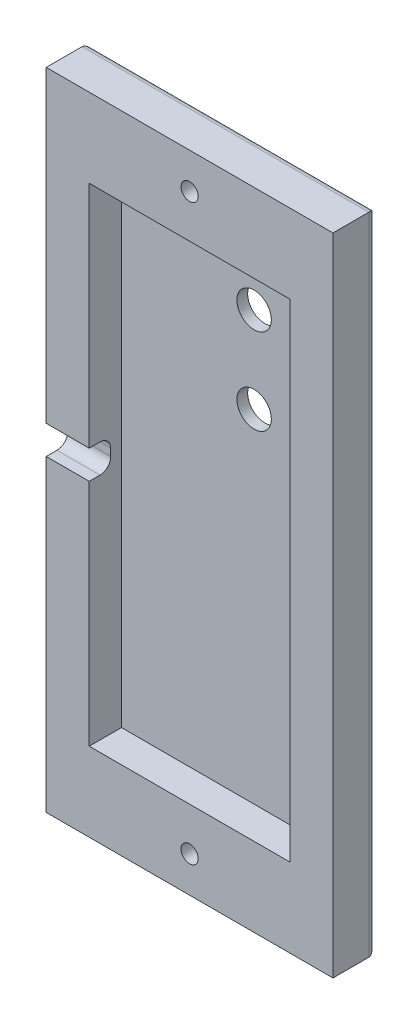
ISO-10303-21;
HEADER;
FILE_DESCRIPTION(('STEP AP214'),'2;1');
FILE_NAME('part.step','',(''),(''),'','','');
FILE_SCHEMA(('AUTOMOTIVE_DESIGN { 1 0 10303 214 1 1 1 1 }'));
ENDSEC;
DATA;
#1=APPLICATION_CONTEXT('core data for automotive mechanical design processes');
#2=APPLICATION_PROTOCOL_DEFINITION('international standard','automotive_design',2000,#1);
#3=PRODUCT_CONTEXT('',#1,'mechanical');
#4=PRODUCT('Part','Part','',(#3));
#5=PRODUCT_RELATED_PRODUCT_CATEGORY('part','',(#4));
#6=PRODUCT_DEFINITION_FORMATION('','',#4);
#7=PRODUCT_DEFINITION_CONTEXT('part definition',#1,'design');
#8=PRODUCT_DEFINITION('design','',#6,#7);
#9=PRODUCT_DEFINITION_SHAPE('','',#8);
#10=(LENGTH_UNIT() NAMED_UNIT(*) SI_UNIT(.MILLI.,.METRE.));
#11=(NAMED_UNIT(*) PLANE_ANGLE_UNIT() SI_UNIT($,.RADIAN.));
#12=(NAMED_UNIT(*) SI_UNIT($,.STERADIAN.) SOLID_ANGLE_UNIT());
#13=UNCERTAINTY_MEASURE_WITH_UNIT(LENGTH_MEASURE(1.E-05),#10,'distance_accuracy_value','');
#14=(GEOMETRIC_REPRESENTATION_CONTEXT(3) GLOBAL_UNCERTAINTY_ASSIGNED_CONTEXT((#13)) GLOBAL_UNIT_ASSIGNED_CONTEXT((#10,
#11,#12)) REPRESENTATION_CONTEXT('',''));
#15=CARTESIAN_POINT('',(0.,0.,0.));
#16=DIRECTION('',(0.,0.,1.));
#17=DIRECTION('',(1.,0.,0.));
#18=AXIS2_PLACEMENT_3D('',#15,#16,#17);
#19=CARTESIAN_POINT('',(-40.,0.,6.));
#20=DIRECTION('',(1.,0.,0.));
#21=DIRECTION('',(0.,0.,-1.));
#22=AXIS2_PLACEMENT_3D('',#19,#20,#21);
#23=PLANE('',#22);
#24=DIRECTION('',(0.,0.,-1.));
#25=VECTOR('',#24,1.);
#26=CARTESIAN_POINT('',(-40.,47.,6.));
#27=LINE('',#26,#25);
#28=CARTESIAN_POINT('',(-40.,47.,6.));
#29=VERTEX_POINT('',#28);
#30=CARTESIAN_POINT('',(-40.,47.,4.5));
#31=VERTEX_POINT('',#30);
#32=EDGE_CURVE('E258',#29,#31,#27,.T.);
#33=ORIENTED_EDGE('',*,*,#32,.F.);
#34=DIRECTION('',(0.,-1.,0.));
#35=VECTOR('',#34,1.);
#36=CARTESIAN_POINT('',(-40.,0.,6.));
#37=LINE('',#36,#35);
#38=CARTESIAN_POINT('',(-40.,90.,6.));
#39=VERTEX_POINT('',#38);
#40=EDGE_CURVE('E174',#39,#29,#37,.T.);
#41=ORIENTED_EDGE('',*,*,#40,.F.);
#42=DIRECTION('',(0.,0.,-1.));
#43=VECTOR('',#42,1.);
#44=CARTESIAN_POINT('',(-40.,90.,6.));
#45=LINE('',#44,#43);
#46=CARTESIAN_POINT('',(-40.,90.,1.));
#47=VERTEX_POINT('',#46);
#48=EDGE_CURVE('E183',#39,#47,#45,.T.);
#49=ORIENTED_EDGE('',*,*,#48,.T.);
#50=DIRECTION('',(0.,-1.,0.));
#51=VECTOR('',#50,1.);
#52=CARTESIAN_POINT('',(-40.,0.,1.));
#53=LINE('',#52,#51);
#54=CARTESIAN_POINT('',(-40.,0.,1.));
#55=VERTEX_POINT('',#54);
#56=EDGE_CURVE('E212',#47,#55,#53,.T.);
#57=ORIENTED_EDGE('',*,*,#56,.T.);
#58=DIRECTION('',(0.,0.,-1.));
#59=VECTOR('',#58,1.);
#60=CARTESIAN_POINT('',(-40.,0.,6.));
#61=LINE('',#60,#59);
#62=CARTESIAN_POINT('',(-40.,0.,6.));
#63=VERTEX_POINT('',#62);
#64=EDGE_CURVE('E173',#63,#55,#61,.T.);
#65=ORIENTED_EDGE('',*,*,#64,.F.);
#66=CARTESIAN_POINT('',(-40.,43.,6.));
#67=VERTEX_POINT('',#66);
#68=EDGE_CURVE('E168',#67,#63,#37,.T.);
#69=ORIENTED_EDGE('',*,*,#68,.F.);
#70=DIRECTION('',(0.,0.,1.));
#71=VECTOR('',#70,1.);
#72=CARTESIAN_POINT('',(-40.,43.,6.));
#73=LINE('',#72,#71);
#74=CARTESIAN_POINT('',(-40.,43.,4.5));
#75=VERTEX_POINT('',#74);
#76=EDGE_CURVE('E155',#75,#67,#73,.T.);
#77=ORIENTED_EDGE('',*,*,#76,.F.);
#78=CARTESIAN_POINT('',(-40.,44.5,4.5));
#79=DIRECTION('',(1.,0.,0.));
#80=DIRECTION('',(0.,0.,-1.));
#81=AXIS2_PLACEMENT_3D('',#78,#79,#80);
#82=CIRCLE('',#81,1.5);
#83=CARTESIAN_POINT('',(-40.,44.5,3.));
#84=VERTEX_POINT('',#83);
#85=EDGE_CURVE('E242',#75,#84,#82,.T.);
#86=ORIENTED_EDGE('',*,*,#85,.T.);
#87=DIRECTION('',(0.,-1.,0.));
#88=VECTOR('',#87,1.);
#89=CARTESIAN_POINT('',(-40.,47.,3.));
#90=LINE('',#89,#88);
#91=CARTESIAN_POINT('',(-40.,45.5,3.));
#92=VERTEX_POINT('',#91);
#93=EDGE_CURVE('E163',#92,#84,#90,.T.);
#94=ORIENTED_EDGE('',*,*,#93,.F.);
#95=CARTESIAN_POINT('',(-40.,45.5,4.5));
#96=DIRECTION('',(1.,0.,0.));
#97=DIRECTION('',(0.,0.,-1.));
#98=AXIS2_PLACEMENT_3D('',#95,#96,#97);
#99=CIRCLE('',#98,1.5);
#100=EDGE_CURVE('E50',#92,#31,#99,.T.);
#101=ORIENTED_EDGE('',*,*,#100,.T.);
#102=EDGE_LOOP('',(#33,#41,#49,#57,#65,#69,#77,#86,#94,#101));
#103=FACE_BOUND('',#102,.T.);
#104=ADVANCED_FACE('F39',(#103),#23,.F.);
#105=CARTESIAN_POINT('',(-20.,85.,0.));
#106=DIRECTION('',(0.,0.,1.));
#107=DIRECTION('',(1.,0.,0.));
#108=AXIS2_PLACEMENT_3D('',#105,#106,#107);
#109=CYLINDRICAL_SURFACE('',#108,1.2);
#110=CARTESIAN_POINT('',(-20.,85.,6.));
#111=DIRECTION('',(0.,0.,1.));
#112=DIRECTION('',(1.,0.,0.));
#113=AXIS2_PLACEMENT_3D('',#110,#111,#112);
#114=CIRCLE('',#113,1.2);
#115=CARTESIAN_POINT('',(-18.8,85.,6.));
#116=VERTEX_POINT('',#115);
#117=EDGE_CURVE('E286',#116,#116,#114,.T.);
#118=ORIENTED_EDGE('',*,*,#117,.T.);
#119=EDGE_LOOP('',(#118));
#120=FACE_BOUND('',#119,.T.);
#121=CARTESIAN_POINT('',(-20.,85.,2.4));
#122=DIRECTION('',(0.,0.,-1.));
#123=DIRECTION('',(-1.,0.,0.));
#124=AXIS2_PLACEMENT_3D('',#121,#122,#123);
#125=CIRCLE('',#124,1.2);
#126=CARTESIAN_POINT('',(-21.2,85.,2.4));
#127=VERTEX_POINT('',#126);
#128=EDGE_CURVE('E200',#127,#127,#125,.F.);
#129=ORIENTED_EDGE('',*,*,#128,.F.);
#130=EDGE_LOOP('',(#129));
#131=FACE_BOUND('',#130,.T.);
#132=ADVANCED_FACE('F371',(#120,#131),#109,.F.);
#133=CARTESIAN_POINT('',(-20.,5.,0.));
#134=DIRECTION('',(0.,0.,1.));
#135=DIRECTION('',(1.,0.,0.));
#136=AXIS2_PLACEMENT_3D('',#133,#134,#135);
#137=CYLINDRICAL_SURFACE('',#136,1.2);
#138=CARTESIAN_POINT('',(-20.,5.,6.));
#139=DIRECTION('',(0.,0.,1.));
#140=DIRECTION('',(1.,0.,0.));
#141=AXIS2_PLACEMENT_3D('',#138,#139,#140);
#142=CIRCLE('',#141,1.2);
#143=CARTESIAN_POINT('',(-18.8,5.,6.));
#144=VERTEX_POINT('',#143);
#145=EDGE_CURVE('E276',#144,#144,#142,.T.);
#146=ORIENTED_EDGE('',*,*,#145,.T.);
#147=EDGE_LOOP('',(#146));
#148=FACE_BOUND('',#147,.T.);
#149=CARTESIAN_POINT('',(-20.,5.,2.4));
#150=DIRECTION('',(0.,0.,-1.));
#151=DIRECTION('',(-1.,0.,0.));
#152=AXIS2_PLACEMENT_3D('',#149,#150,#151);
#153=CIRCLE('',#152,1.2);
#154=CARTESIAN_POINT('',(-21.2,5.,2.4));
#155=VERTEX_POINT('',#154);
#156=EDGE_CURVE('E193',#155,#155,#153,.F.);
#157=ORIENTED_EDGE('',*,*,#156,.F.);
#158=EDGE_LOOP('',(#157));
#159=FACE_BOUND('',#158,.T.);
#160=ADVANCED_FACE('F380',(#148,#159),#137,.F.);
#161=CARTESIAN_POINT('',(0.,0.,6.));
#162=DIRECTION('',(0.,1.,0.));
#163=DIRECTION('',(0.,0.,1.));
#164=AXIS2_PLACEMENT_3D('',#161,#162,#163);
#165=PLANE('',#164);
#166=ORIENTED_EDGE('',*,*,#64,.T.);
#167=DIRECTION('',(1.,0.,0.));
#168=VECTOR('',#167,1.);
#169=CARTESIAN_POINT('',(0.,0.,1.));
#170=LINE('',#169,#168);
#171=CARTESIAN_POINT('',(0.,0.,1.));
#172=VERTEX_POINT('',#171);
#173=EDGE_CURVE('E220',#55,#172,#170,.T.);
#174=ORIENTED_EDGE('',*,*,#173,.T.);
#175=DIRECTION('',(0.,0.,-1.));
#176=VECTOR('',#175,1.);
#177=CARTESIAN_POINT('',(0.,0.,6.));
#178=LINE('',#177,#176);
#179=CARTESIAN_POINT('',(0.,0.,6.));
#180=VERTEX_POINT('',#179);
#181=EDGE_CURVE('E188',#180,#172,#178,.T.);
#182=ORIENTED_EDGE('',*,*,#181,.F.);
#183=DIRECTION('',(1.,0.,0.));
#184=VECTOR('',#183,1.);
#185=CARTESIAN_POINT('',(0.,0.,6.));
#186=LINE('',#185,#184);
#187=EDGE_CURVE('E317',#63,#180,#186,.T.);
#188=ORIENTED_EDGE('',*,*,#187,.F.);
#189=EDGE_LOOP('',(#166,#174,#182,#188));
#190=FACE_BOUND('',#189,.T.);
#191=ADVANCED_FACE('F386',(#190),#165,.F.);
#192=CARTESIAN_POINT('',(0.,0.,6.));
#193=DIRECTION('',(-1.,0.,0.));
#194=DIRECTION('',(0.,0.,1.));
#195=AXIS2_PLACEMENT_3D('',#192,#193,#194);
#196=PLANE('',#195);
#197=ORIENTED_EDGE('',*,*,#181,.T.);
#198=DIRECTION('',(0.,1.,0.));
#199=VECTOR('',#198,1.);
#200=CARTESIAN_POINT('',(0.,90.,1.));
#201=LINE('',#200,#199);
#202=CARTESIAN_POINT('',(0.,90.,1.));
#203=VERTEX_POINT('',#202);
#204=EDGE_CURVE('E215',#172,#203,#201,.T.);
#205=ORIENTED_EDGE('',*,*,#204,.T.);
#206=DIRECTION('',(0.,0.,-1.));
#207=VECTOR('',#206,1.);
#208=CARTESIAN_POINT('',(0.,90.,6.));
#209=LINE('',#208,#207);
#210=CARTESIAN_POINT('',(0.,90.,6.));
#211=VERTEX_POINT('',#210);
#212=EDGE_CURVE('E190',#211,#203,#209,.T.);
#213=ORIENTED_EDGE('',*,*,#212,.F.);
#214=DIRECTION('',(0.,1.,0.));
#215=VECTOR('',#214,1.);
#216=CARTESIAN_POINT('',(0.,0.,6.));
#217=LINE('',#216,#215);
#218=EDGE_CURVE('E177',#180,#211,#217,.T.);
#219=ORIENTED_EDGE('',*,*,#218,.F.);
#220=EDGE_LOOP('',(#197,#205,#213,#219));
#221=FACE_BOUND('',#220,.T.);
#222=ADVANCED_FACE('F329',(#221),#196,.F.);
#223=CARTESIAN_POINT('',(0.,90.,6.));
#224=DIRECTION('',(0.,-1.,0.));
#225=DIRECTION('',(0.,0.,-1.));
#226=AXIS2_PLACEMENT_3D('',#223,#224,#225);
#227=PLANE('',#226);
#228=ORIENTED_EDGE('',*,*,#212,.T.);
#229=DIRECTION('',(-1.,0.,0.));
#230=VECTOR('',#229,1.);
#231=CARTESIAN_POINT('',(-40.,90.,1.));
#232=LINE('',#231,#230);
#233=EDGE_CURVE('E195',#203,#47,#232,.T.);
#234=ORIENTED_EDGE('',*,*,#233,.T.);
#235=ORIENTED_EDGE('',*,*,#48,.F.);
#236=DIRECTION('',(-1.,0.,0.));
#237=VECTOR('',#236,1.);
#238=CARTESIAN_POINT('',(0.,90.,6.));
#239=LINE('',#238,#237);
#240=EDGE_CURVE('E176',#211,#39,#239,.T.);
#241=ORIENTED_EDGE('',*,*,#240,.F.);
#242=EDGE_LOOP('',(#228,#234,#235,#241));
#243=FACE_BOUND('',#242,.T.);
#244=ADVANCED_FACE('F331',(#243),#227,.F.);
#245=CARTESIAN_POINT('',(0.,0.,6.));
#246=DIRECTION('',(0.,0.,-1.));
#247=DIRECTION('',(-1.,0.,0.));
#248=AXIS2_PLACEMENT_3D('',#245,#246,#247);
#249=PLANE('',#248);
#250=ORIENTED_EDGE('',*,*,#145,.F.);
#251=EDGE_LOOP('',(#250));
#252=FACE_BOUND('',#251,.T.);
#253=ORIENTED_EDGE('',*,*,#117,.F.);
#254=EDGE_LOOP('',(#253));
#255=FACE_BOUND('',#254,.T.);
#256=DIRECTION('',(0.,-1.,0.));
#257=VECTOR('',#256,1.);
#258=CARTESIAN_POINT('',(-34.,79.,6.));
#259=LINE('',#258,#257);
#260=CARTESIAN_POINT('',(-34.,43.,6.));
#261=VERTEX_POINT('',#260);
#262=CARTESIAN_POINT('',(-34.,11.,6.));
#263=VERTEX_POINT('',#262);
#264=EDGE_CURVE('E169',#261,#263,#259,.T.);
#265=ORIENTED_EDGE('',*,*,#264,.F.);
#266=DIRECTION('',(-1.,0.,0.));
#267=VECTOR('',#266,1.);
#268=CARTESIAN_POINT('',(-30.,43.,6.));
#269=LINE('',#268,#267);
#270=EDGE_CURVE('E158',#261,#67,#269,.T.);
#271=ORIENTED_EDGE('',*,*,#270,.T.);
#272=ORIENTED_EDGE('',*,*,#68,.T.);
#273=ORIENTED_EDGE('',*,*,#187,.T.);
#274=ORIENTED_EDGE('',*,*,#218,.T.);
#275=ORIENTED_EDGE('',*,*,#240,.T.);
#276=ORIENTED_EDGE('',*,*,#40,.T.);
#277=DIRECTION('',(-1.,0.,0.));
#278=VECTOR('',#277,1.);
#279=CARTESIAN_POINT('',(-30.,47.,6.));
#280=LINE('',#279,#278);
#281=CARTESIAN_POINT('',(-34.,47.,6.));
#282=VERTEX_POINT('',#281);
#283=EDGE_CURVE('E167',#282,#29,#280,.T.);
#284=ORIENTED_EDGE('',*,*,#283,.F.);
#285=CARTESIAN_POINT('',(-34.,79.,6.));
#286=VERTEX_POINT('',#285);
#287=EDGE_CURVE('E310',#286,#282,#259,.T.);
#288=ORIENTED_EDGE('',*,*,#287,.F.);
#289=DIRECTION('',(-1.,0.,0.));
#290=VECTOR('',#289,1.);
#291=CARTESIAN_POINT('',(-34.,79.,6.));
#292=LINE('',#291,#290);
#293=CARTESIAN_POINT('',(-6.00000000000001,79.,6.));
#294=VERTEX_POINT('',#293);
#295=EDGE_CURVE('E293',#294,#286,#292,.T.);
#296=ORIENTED_EDGE('',*,*,#295,.F.);
#297=DIRECTION('',(0.,1.,0.));
#298=VECTOR('',#297,1.);
#299=CARTESIAN_POINT('',(-6.00000000000001,79.,6.));
#300=LINE('',#299,#298);
#301=CARTESIAN_POINT('',(-6.00000000000001,11.,6.));
#302=VERTEX_POINT('',#301);
#303=EDGE_CURVE('E298',#302,#294,#300,.T.);
#304=ORIENTED_EDGE('',*,*,#303,.F.);
#305=DIRECTION('',(1.,0.,0.));
#306=VECTOR('',#305,1.);
#307=CARTESIAN_POINT('',(-34.,11.,6.));
#308=LINE('',#307,#306);
#309=EDGE_CURVE('E307',#263,#302,#308,.T.);
#310=ORIENTED_EDGE('',*,*,#309,.F.);
#311=EDGE_LOOP('',(#265,#271,#272,#273,#274,#275,#276,#284,#288,#296,#304,#310));
#312=FACE_BOUND('',#311,.T.);
#313=ADVANCED_FACE('F165',(#252,#255,#312),#249,.F.);
#314=CARTESIAN_POINT('',(0.,0.,0.));
#315=DIRECTION('',(0.,0.,-1.));
#316=DIRECTION('',(-1.,0.,0.));
#317=AXIS2_PLACEMENT_3D('',#314,#315,#316);
#318=PLANE('',#317);
#319=DIRECTION('',(0.,-1.,0.));
#320=VECTOR('',#319,1.);
#321=CARTESIAN_POINT('',(-39.,90.,0.));
#322=LINE('',#321,#320);
#323=CARTESIAN_POINT('',(-39.,1.,0.));
#324=VERTEX_POINT('',#323);
#325=CARTESIAN_POINT('',(-39.,89.,0.));
#326=VERTEX_POINT('',#325);
#327=EDGE_CURVE('E207',#324,#326,#322,.F.);
#328=ORIENTED_EDGE('',*,*,#327,.T.);
#329=DIRECTION('',(-1.,0.,0.));
#330=VECTOR('',#329,1.);
#331=CARTESIAN_POINT('',(0.,89.,0.));
#332=LINE('',#331,#330);
#333=CARTESIAN_POINT('',(-1.,89.,0.));
#334=VERTEX_POINT('',#333);
#335=EDGE_CURVE('E208',#326,#334,#332,.F.);
#336=ORIENTED_EDGE('',*,*,#335,.T.);
#337=DIRECTION('',(0.,1.,0.));
#338=VECTOR('',#337,1.);
#339=CARTESIAN_POINT('',(-1.,0.,0.));
#340=LINE('',#339,#338);
#341=CARTESIAN_POINT('',(-1.,1.,0.));
#342=VERTEX_POINT('',#341);
#343=EDGE_CURVE('E206',#334,#342,#340,.F.);
#344=ORIENTED_EDGE('',*,*,#343,.T.);
#345=DIRECTION('',(1.,0.,0.));
#346=VECTOR('',#345,1.);
#347=CARTESIAN_POINT('',(-40.,1.,0.));
#348=LINE('',#347,#346);
#349=EDGE_CURVE('E204',#342,#324,#348,.F.);
#350=ORIENTED_EDGE('',*,*,#349,.T.);
#351=EDGE_LOOP('',(#328,#336,#344,#350));
#352=FACE_BOUND('',#351,.T.);
#353=CARTESIAN_POINT('',(-20.,5.,0.));
#354=DIRECTION('',(0.,0.,-1.));
#355=DIRECTION('',(-1.,0.,0.));
#356=AXIS2_PLACEMENT_3D('',#353,#354,#355);
#357=CIRCLE('',#356,2.15);
#358=CARTESIAN_POINT('',(-22.15,5.,0.));
#359=VERTEX_POINT('',#358);
#360=EDGE_CURVE('E268',#359,#359,#357,.T.);
#361=ORIENTED_EDGE('',*,*,#360,.F.);
#362=EDGE_LOOP('',(#361));
#363=FACE_BOUND('',#362,.T.);
#364=CARTESIAN_POINT('',(-20.,85.,0.));
#365=DIRECTION('',(0.,0.,-1.));
#366=DIRECTION('',(-1.,0.,0.));
#367=AXIS2_PLACEMENT_3D('',#364,#365,#366);
#368=CIRCLE('',#367,2.15);
#369=CARTESIAN_POINT('',(-22.15,85.,0.));
#370=VERTEX_POINT('',#369);
#371=EDGE_CURVE('E269',#370,#370,#368,.T.);
#372=ORIENTED_EDGE('',*,*,#371,.F.);
#373=EDGE_LOOP('',(#372));
#374=FACE_BOUND('',#373,.T.);
#375=CARTESIAN_POINT('',(-15.5,70.7,0.));
#376=DIRECTION('',(0.,0.,1.));
#377=DIRECTION('',(1.,0.,0.));
#378=AXIS2_PLACEMENT_3D('',#375,#376,#377);
#379=CIRCLE('',#378,2.4);
#380=CARTESIAN_POINT('',(-13.1,70.7,0.));
#381=VERTEX_POINT('',#380);
#382=EDGE_CURVE('E274',#381,#381,#379,.T.);
#383=ORIENTED_EDGE('',*,*,#382,.T.);
#384=EDGE_LOOP('',(#383));
#385=FACE_BOUND('',#384,.T.);
#386=CARTESIAN_POINT('',(-15.5,58.7,0.));
#387=DIRECTION('',(0.,0.,1.));
#388=DIRECTION('',(1.,0.,0.));
#389=AXIS2_PLACEMENT_3D('',#386,#387,#388);
#390=CIRCLE('',#389,2.4);
#391=CARTESIAN_POINT('',(-13.1,58.7,0.));
#392=VERTEX_POINT('',#391);
#393=EDGE_CURVE('E203',#392,#392,#390,.T.);
#394=ORIENTED_EDGE('',*,*,#393,.T.);
#395=EDGE_LOOP('',(#394));
#396=FACE_BOUND('',#395,.T.);
#397=ADVANCED_FACE('F382',(#352,#363,#374,#385,#396),#318,.T.);
#398=CARTESIAN_POINT('',(-34.,79.,1.5));
#399=DIRECTION('',(0.,1.,0.));
#400=DIRECTION('',(-1.,0.,0.));
#401=AXIS2_PLACEMENT_3D('',#398,#399,#400);
#402=PLANE('',#401);
#403=ORIENTED_EDGE('',*,*,#295,.T.);
#404=DIRECTION('',(0.,0.,1.));
#405=VECTOR('',#404,1.);
#406=CARTESIAN_POINT('',(-34.,79.,1.5));
#407=LINE('',#406,#405);
#408=CARTESIAN_POINT('',(-34.,79.,1.5));
#409=VERTEX_POINT('',#408);
#410=EDGE_CURVE('E304',#409,#286,#407,.T.);
#411=ORIENTED_EDGE('',*,*,#410,.F.);
#412=DIRECTION('',(-1.,0.,0.));
#413=VECTOR('',#412,1.);
#414=CARTESIAN_POINT('',(-34.,79.,1.5));
#415=LINE('',#414,#413);
#416=CARTESIAN_POINT('',(-6.00000000000001,79.,1.5));
#417=VERTEX_POINT('',#416);
#418=EDGE_CURVE('E292',#417,#409,#415,.T.);
#419=ORIENTED_EDGE('',*,*,#418,.F.);
#420=DIRECTION('',(0.,0.,1.));
#421=VECTOR('',#420,1.);
#422=CARTESIAN_POINT('',(-6.00000000000001,79.,1.5));
#423=LINE('',#422,#421);
#424=EDGE_CURVE('E313',#417,#294,#423,.T.);
#425=ORIENTED_EDGE('',*,*,#424,.T.);
#426=EDGE_LOOP('',(#403,#411,#419,#425));
#427=FACE_BOUND('',#426,.T.);
#428=ADVANCED_FACE('F345',(#427),#402,.F.);
#429=CARTESIAN_POINT('',(-6.00000000000001,79.,1.5));
#430=DIRECTION('',(1.,0.,0.));
#431=DIRECTION('',(0.,0.,-1.));
#432=AXIS2_PLACEMENT_3D('',#429,#430,#431);
#433=PLANE('',#432);
#434=ORIENTED_EDGE('',*,*,#303,.T.);
#435=ORIENTED_EDGE('',*,*,#424,.F.);
#436=DIRECTION('',(0.,1.,0.));
#437=VECTOR('',#436,1.);
#438=CARTESIAN_POINT('',(-6.00000000000001,79.,1.5));
#439=LINE('',#438,#437);
#440=CARTESIAN_POINT('',(-6.00000000000001,11.,1.5));
#441=VERTEX_POINT('',#440);
#442=EDGE_CURVE('E305',#441,#417,#439,.T.);
#443=ORIENTED_EDGE('',*,*,#442,.F.);
#444=DIRECTION('',(0.,0.,1.));
#445=VECTOR('',#444,1.);
#446=CARTESIAN_POINT('',(-6.00000000000001,11.,1.5));
#447=LINE('',#446,#445);
#448=EDGE_CURVE('E320',#441,#302,#447,.T.);
#449=ORIENTED_EDGE('',*,*,#448,.T.);
#450=EDGE_LOOP('',(#434,#435,#443,#449));
#451=FACE_BOUND('',#450,.T.);
#452=ADVANCED_FACE('F348',(#451),#433,.F.);
#453=CARTESIAN_POINT('',(-34.,11.,1.5));
#454=DIRECTION('',(0.,-1.,0.));
#455=DIRECTION('',(1.,0.,0.));
#456=AXIS2_PLACEMENT_3D('',#453,#454,#455);
#457=PLANE('',#456);
#458=ORIENTED_EDGE('',*,*,#309,.T.);
#459=ORIENTED_EDGE('',*,*,#448,.F.);
#460=DIRECTION('',(1.,0.,0.));
#461=VECTOR('',#460,1.);
#462=CARTESIAN_POINT('',(-34.,11.,1.5));
#463=LINE('',#462,#461);
#464=CARTESIAN_POINT('',(-34.,11.,1.5));
#465=VERTEX_POINT('',#464);
#466=EDGE_CURVE('E299',#465,#441,#463,.T.);
#467=ORIENTED_EDGE('',*,*,#466,.F.);
#468=DIRECTION('',(0.,0.,1.));
#469=VECTOR('',#468,1.);
#470=CARTESIAN_POINT('',(-34.,11.,1.5));
#471=LINE('',#470,#469);
#472=EDGE_CURVE('E316',#465,#263,#471,.T.);
#473=ORIENTED_EDGE('',*,*,#472,.T.);
#474=EDGE_LOOP('',(#458,#459,#467,#473));
#475=FACE_BOUND('',#474,.T.);
#476=ADVANCED_FACE('F347',(#475),#457,.F.);
#477=CARTESIAN_POINT('',(-34.,79.,1.5));
#478=DIRECTION('',(-1.,0.,0.));
#479=DIRECTION('',(0.,-1.,0.));
#480=AXIS2_PLACEMENT_3D('',#477,#478,#479);
#481=PLANE('',#480);
#482=ORIENTED_EDGE('',*,*,#287,.T.);
#483=DIRECTION('',(0.,0.,-1.));
#484=VECTOR('',#483,1.);
#485=CARTESIAN_POINT('',(-34.,47.,1.5));
#486=LINE('',#485,#484);
#487=CARTESIAN_POINT('',(-34.,47.,4.5));
#488=VERTEX_POINT('',#487);
#489=EDGE_CURVE('E232',#282,#488,#486,.T.);
#490=ORIENTED_EDGE('',*,*,#489,.T.);
#491=CARTESIAN_POINT('',(-34.,45.5,4.5));
#492=DIRECTION('',(-1.,0.,0.));
#493=DIRECTION('',(0.,-1.,0.));
#494=AXIS2_PLACEMENT_3D('',#491,#492,#493);
#495=CIRCLE('',#494,1.5);
#496=CARTESIAN_POINT('',(-34.,45.5,3.));
#497=VERTEX_POINT('',#496);
#498=EDGE_CURVE('E11',#488,#497,#495,.T.);
#499=ORIENTED_EDGE('',*,*,#498,.T.);
#500=DIRECTION('',(0.,-1.,0.));
#501=VECTOR('',#500,1.);
#502=CARTESIAN_POINT('',(-34.,79.,3.));
#503=LINE('',#502,#501);
#504=CARTESIAN_POINT('',(-34.,44.5,3.));
#505=VERTEX_POINT('',#504);
#506=EDGE_CURVE('E219',#497,#505,#503,.T.);
#507=ORIENTED_EDGE('',*,*,#506,.T.);
#508=CARTESIAN_POINT('',(-34.,44.5,4.5));
#509=DIRECTION('',(-1.,0.,0.));
#510=DIRECTION('',(0.,-1.,0.));
#511=AXIS2_PLACEMENT_3D('',#508,#509,#510);
#512=CIRCLE('',#511,1.5);
#513=CARTESIAN_POINT('',(-34.,43.,4.5));
#514=VERTEX_POINT('',#513);
#515=EDGE_CURVE('E246',#505,#514,#512,.T.);
#516=ORIENTED_EDGE('',*,*,#515,.T.);
#517=DIRECTION('',(0.,0.,1.));
#518=VECTOR('',#517,1.);
#519=CARTESIAN_POINT('',(-34.,43.,1.5));
#520=LINE('',#519,#518);
#521=EDGE_CURVE('E231',#514,#261,#520,.T.);
#522=ORIENTED_EDGE('',*,*,#521,.T.);
#523=ORIENTED_EDGE('',*,*,#264,.T.);
#524=ORIENTED_EDGE('',*,*,#472,.F.);
#525=DIRECTION('',(0.,-1.,0.));
#526=VECTOR('',#525,1.);
#527=CARTESIAN_POINT('',(-34.,79.,1.5));
#528=LINE('',#527,#526);
#529=EDGE_CURVE('E294',#409,#465,#528,.T.);
#530=ORIENTED_EDGE('',*,*,#529,.F.);
#531=ORIENTED_EDGE('',*,*,#410,.T.);
#532=EDGE_LOOP('',(#482,#490,#499,#507,#516,#522,#523,#524,#530,#531));
#533=FACE_BOUND('',#532,.T.);
#534=ADVANCED_FACE('F249',(#533),#481,.F.);
#535=CARTESIAN_POINT('',(0.,0.,1.5));
#536=DIRECTION('',(0.,0.,-1.));
#537=DIRECTION('',(-1.,0.,0.));
#538=AXIS2_PLACEMENT_3D('',#535,#536,#537);
#539=PLANE('',#538);
#540=CARTESIAN_POINT('',(-15.5,70.7,1.5));
#541=DIRECTION('',(0.,0.,1.));
#542=DIRECTION('',(1.,0.,0.));
#543=AXIS2_PLACEMENT_3D('',#540,#541,#542);
#544=CIRCLE('',#543,2.4);
#545=CARTESIAN_POINT('',(-13.1,70.7,1.5));
#546=VERTEX_POINT('',#545);
#547=EDGE_CURVE('E280',#546,#546,#544,.T.);
#548=ORIENTED_EDGE('',*,*,#547,.F.);
#549=EDGE_LOOP('',(#548));
#550=FACE_BOUND('',#549,.T.);
#551=CARTESIAN_POINT('',(-15.5,58.7,1.5));
#552=DIRECTION('',(0.,0.,1.));
#553=DIRECTION('',(1.,0.,0.));
#554=AXIS2_PLACEMENT_3D('',#551,#552,#553);
#555=CIRCLE('',#554,2.4);
#556=CARTESIAN_POINT('',(-13.1,58.7,1.5));
#557=VERTEX_POINT('',#556);
#558=EDGE_CURVE('E283',#557,#557,#555,.T.);
#559=ORIENTED_EDGE('',*,*,#558,.F.);
#560=EDGE_LOOP('',(#559));
#561=FACE_BOUND('',#560,.T.);
#562=ORIENTED_EDGE('',*,*,#418,.T.);
#563=ORIENTED_EDGE('',*,*,#529,.T.);
#564=ORIENTED_EDGE('',*,*,#466,.T.);
#565=ORIENTED_EDGE('',*,*,#442,.T.);
#566=EDGE_LOOP('',(#562,#563,#564,#565));
#567=FACE_BOUND('',#566,.T.);
#568=ADVANCED_FACE('F355',(#550,#561,#567),#539,.F.);
#569=CARTESIAN_POINT('',(-15.5,58.7,0.));
#570=DIRECTION('',(0.,0.,1.));
#571=DIRECTION('',(1.,0.,0.));
#572=AXIS2_PLACEMENT_3D('',#569,#570,#571);
#573=CYLINDRICAL_SURFACE('',#572,2.4);
#574=ORIENTED_EDGE('',*,*,#393,.F.);
#575=EDGE_LOOP('',(#574));
#576=FACE_BOUND('',#575,.T.);
#577=ORIENTED_EDGE('',*,*,#558,.T.);
#578=EDGE_LOOP('',(#577));
#579=FACE_BOUND('',#578,.T.);
#580=ADVANCED_FACE('F354',(#576,#579),#573,.F.);
#581=CARTESIAN_POINT('',(-15.5,70.7,0.));
#582=DIRECTION('',(0.,0.,1.));
#583=DIRECTION('',(1.,0.,0.));
#584=AXIS2_PLACEMENT_3D('',#581,#582,#583);
#585=CYLINDRICAL_SURFACE('',#584,2.4);
#586=ORIENTED_EDGE('',*,*,#382,.F.);
#587=EDGE_LOOP('',(#586));
#588=FACE_BOUND('',#587,.T.);
#589=ORIENTED_EDGE('',*,*,#547,.T.);
#590=EDGE_LOOP('',(#589));
#591=FACE_BOUND('',#590,.T.);
#592=ADVANCED_FACE('F363',(#588,#591),#585,.F.);
#593=CARTESIAN_POINT('',(-20.,5.,2.4));
#594=DIRECTION('',(0.,0.,-1.));
#595=DIRECTION('',(-1.,0.,0.));
#596=AXIS2_PLACEMENT_3D('',#593,#594,#595);
#597=PLANE('',#596);
#598=CARTESIAN_POINT('',(-20.,5.,2.4));
#599=DIRECTION('',(0.,0.,-1.));
#600=DIRECTION('',(-1.,0.,0.));
#601=AXIS2_PLACEMENT_3D('',#598,#599,#600);
#602=CIRCLE('',#601,2.15);
#603=CARTESIAN_POINT('',(-22.15,5.,2.4));
#604=VERTEX_POINT('',#603);
#605=EDGE_CURVE('E196',#604,#604,#602,.T.);
#606=ORIENTED_EDGE('',*,*,#605,.T.);
#607=EDGE_LOOP('',(#606));
#608=FACE_BOUND('',#607,.T.);
#609=ORIENTED_EDGE('',*,*,#156,.T.);
#610=EDGE_LOOP('',(#609));
#611=FACE_BOUND('',#610,.T.);
#612=ADVANCED_FACE('F422',(#608,#611),#597,.T.);
#613=CARTESIAN_POINT('',(-20.,5.,2.4));
#614=DIRECTION('',(0.,0.,-1.));
#615=DIRECTION('',(-1.,0.,0.));
#616=AXIS2_PLACEMENT_3D('',#613,#614,#615);
#617=CYLINDRICAL_SURFACE('',#616,2.15);
#618=ORIENTED_EDGE('',*,*,#605,.F.);
#619=EDGE_LOOP('',(#618));
#620=FACE_BOUND('',#619,.T.);
#621=ORIENTED_EDGE('',*,*,#360,.T.);
#622=EDGE_LOOP('',(#621));
#623=FACE_BOUND('',#622,.T.);
#624=ADVANCED_FACE('F424',(#620,#623),#617,.F.);
#625=CARTESIAN_POINT('',(-20.,85.,2.4));
#626=DIRECTION('',(0.,0.,-1.));
#627=DIRECTION('',(-1.,0.,0.));
#628=AXIS2_PLACEMENT_3D('',#625,#626,#627);
#629=PLANE('',#628);
#630=CARTESIAN_POINT('',(-20.,85.,2.4));
#631=DIRECTION('',(0.,0.,-1.));
#632=DIRECTION('',(-1.,0.,0.));
#633=AXIS2_PLACEMENT_3D('',#630,#631,#632);
#634=CIRCLE('',#633,2.15);
#635=CARTESIAN_POINT('',(-22.15,85.,2.4));
#636=VERTEX_POINT('',#635);
#637=EDGE_CURVE('E229',#636,#636,#634,.T.);
#638=ORIENTED_EDGE('',*,*,#637,.T.);
#639=EDGE_LOOP('',(#638));
#640=FACE_BOUND('',#639,.T.);
#641=ORIENTED_EDGE('',*,*,#128,.T.);
#642=EDGE_LOOP('',(#641));
#643=FACE_BOUND('',#642,.T.);
#644=ADVANCED_FACE('F429',(#640,#643),#629,.T.);
#645=CARTESIAN_POINT('',(-20.,85.,2.4));
#646=DIRECTION('',(0.,0.,-1.));
#647=DIRECTION('',(-1.,0.,0.));
#648=AXIS2_PLACEMENT_3D('',#645,#646,#647);
#649=CYLINDRICAL_SURFACE('',#648,2.15);
#650=ORIENTED_EDGE('',*,*,#637,.F.);
#651=EDGE_LOOP('',(#650));
#652=FACE_BOUND('',#651,.T.);
#653=ORIENTED_EDGE('',*,*,#371,.T.);
#654=EDGE_LOOP('',(#653));
#655=FACE_BOUND('',#654,.T.);
#656=ADVANCED_FACE('F409',(#652,#655),#649,.F.);
#657=CARTESIAN_POINT('',(0.,1.,1.));
#658=DIRECTION('',(-1.,0.,0.));
#659=DIRECTION('',(0.,0.,1.));
#660=AXIS2_PLACEMENT_3D('',#657,#658,#659);
#661=CYLINDRICAL_SURFACE('',#660,1.);
#662=CARTESIAN_POINT('',(-39.,1.,1.));
#663=DIRECTION('',(-0.707106781186547,0.707106781186547,0.));
#664=DIRECTION('',(-0.707106781186547,-0.707106781186547,0.));
#665=AXIS2_PLACEMENT_3D('',#662,#663,#664);
#666=ELLIPSE('',#665,1.41421356237309,1.);
#667=EDGE_CURVE('E224',#324,#55,#666,.T.);
#668=ORIENTED_EDGE('',*,*,#667,.F.);
#669=ORIENTED_EDGE('',*,*,#349,.F.);
#670=CARTESIAN_POINT('',(-1.,1.,1.));
#671=DIRECTION('',(-0.707106781186547,-0.707106781186547,0.));
#672=DIRECTION('',(-0.707106781186547,0.707106781186547,0.));
#673=AXIS2_PLACEMENT_3D('',#670,#671,#672);
#674=ELLIPSE('',#673,1.41421356237309,1.);
#675=EDGE_CURVE('E227',#172,#342,#674,.F.);
#676=ORIENTED_EDGE('',*,*,#675,.F.);
#677=ORIENTED_EDGE('',*,*,#173,.F.);
#678=EDGE_LOOP('',(#668,#669,#676,#677));
#679=FACE_BOUND('',#678,.T.);
#680=ADVANCED_FACE('F401',(#679),#661,.T.);
#681=CARTESIAN_POINT('',(-1.,0.,1.));
#682=DIRECTION('',(0.,-1.,0.));
#683=DIRECTION('',(0.,0.,-1.));
#684=AXIS2_PLACEMENT_3D('',#681,#682,#683);
#685=CYLINDRICAL_SURFACE('',#684,1.);
#686=ORIENTED_EDGE('',*,*,#675,.T.);
#687=ORIENTED_EDGE('',*,*,#343,.F.);
#688=CARTESIAN_POINT('',(-1.,89.,1.));
#689=DIRECTION('',(0.707106781186547,-0.707106781186547,0.));
#690=DIRECTION('',(-0.707106781186547,-0.707106781186547,0.));
#691=AXIS2_PLACEMENT_3D('',#688,#689,#690);
#692=ELLIPSE('',#691,1.41421356237309,1.);
#693=EDGE_CURVE('E225',#203,#334,#692,.F.);
#694=ORIENTED_EDGE('',*,*,#693,.F.);
#695=ORIENTED_EDGE('',*,*,#204,.F.);
#696=EDGE_LOOP('',(#686,#687,#694,#695));
#697=FACE_BOUND('',#696,.T.);
#698=ADVANCED_FACE('F399',(#697),#685,.T.);
#699=CARTESIAN_POINT('',(-39.,0.,1.));
#700=DIRECTION('',(0.,1.,0.));
#701=DIRECTION('',(0.,0.,1.));
#702=AXIS2_PLACEMENT_3D('',#699,#700,#701);
#703=CYLINDRICAL_SURFACE('',#702,1.);
#704=ORIENTED_EDGE('',*,*,#667,.T.);
#705=ORIENTED_EDGE('',*,*,#56,.F.);
#706=CARTESIAN_POINT('',(-39.,89.,1.));
#707=DIRECTION('',(0.707106781186547,0.707106781186547,0.));
#708=DIRECTION('',(-0.707106781186547,0.707106781186547,0.));
#709=AXIS2_PLACEMENT_3D('',#706,#707,#708);
#710=ELLIPSE('',#709,1.41421356237309,1.);
#711=EDGE_CURVE('E217',#326,#47,#710,.T.);
#712=ORIENTED_EDGE('',*,*,#711,.F.);
#713=ORIENTED_EDGE('',*,*,#327,.F.);
#714=EDGE_LOOP('',(#704,#705,#712,#713));
#715=FACE_BOUND('',#714,.T.);
#716=ADVANCED_FACE('F392',(#715),#703,.T.);
#717=CARTESIAN_POINT('',(0.,89.,1.));
#718=DIRECTION('',(1.,0.,0.));
#719=DIRECTION('',(0.,0.,-1.));
#720=AXIS2_PLACEMENT_3D('',#717,#718,#719);
#721=CYLINDRICAL_SURFACE('',#720,1.);
#722=ORIENTED_EDGE('',*,*,#693,.T.);
#723=ORIENTED_EDGE('',*,*,#335,.F.);
#724=ORIENTED_EDGE('',*,*,#711,.T.);
#725=ORIENTED_EDGE('',*,*,#233,.F.);
#726=EDGE_LOOP('',(#722,#723,#724,#725));
#727=FACE_BOUND('',#726,.T.);
#728=ADVANCED_FACE('F393',(#727),#721,.T.);
#729=CARTESIAN_POINT('',(-30.,47.,6.));
#730=DIRECTION('',(0.,1.,0.));
#731=DIRECTION('',(0.,0.,1.));
#732=AXIS2_PLACEMENT_3D('',#729,#730,#731);
#733=PLANE('',#732);
#734=ORIENTED_EDGE('',*,*,#32,.T.);
#735=DIRECTION('',(-1.,0.,0.));
#736=VECTOR('',#735,1.);
#737=CARTESIAN_POINT('',(-34.,47.,4.5));
#738=LINE('',#737,#736);
#739=EDGE_CURVE('E53',#31,#488,#738,.F.);
#740=ORIENTED_EDGE('',*,*,#739,.T.);
#741=ORIENTED_EDGE('',*,*,#489,.F.);
#742=ORIENTED_EDGE('',*,*,#283,.T.);
#743=EDGE_LOOP('',(#734,#740,#741,#742));
#744=FACE_BOUND('',#743,.T.);
#745=ADVANCED_FACE('F394',(#744),#733,.F.);
#746=CARTESIAN_POINT('',(-30.,43.,6.));
#747=DIRECTION('',(0.,-1.,0.));
#748=DIRECTION('',(0.,0.,-1.));
#749=AXIS2_PLACEMENT_3D('',#746,#747,#748);
#750=PLANE('',#749);
#751=ORIENTED_EDGE('',*,*,#521,.F.);
#752=DIRECTION('',(-1.,0.,0.));
#753=VECTOR('',#752,1.);
#754=CARTESIAN_POINT('',(-40.,43.,4.5));
#755=LINE('',#754,#753);
#756=EDGE_CURVE('E159',#514,#75,#755,.T.);
#757=ORIENTED_EDGE('',*,*,#756,.T.);
#758=ORIENTED_EDGE('',*,*,#76,.T.);
#759=ORIENTED_EDGE('',*,*,#270,.F.);
#760=EDGE_LOOP('',(#751,#757,#758,#759));
#761=FACE_BOUND('',#760,.T.);
#762=ADVANCED_FACE('F152',(#761),#750,.F.);
#763=CARTESIAN_POINT('',(-30.,47.,3.));
#764=DIRECTION('',(0.,0.,-1.));
#765=DIRECTION('',(-1.,0.,0.));
#766=AXIS2_PLACEMENT_3D('',#763,#764,#765);
#767=PLANE('',#766);
#768=ORIENTED_EDGE('',*,*,#93,.T.);
#769=DIRECTION('',(-1.,0.,0.));
#770=VECTOR('',#769,1.);
#771=CARTESIAN_POINT('',(-34.,44.5,3.));
#772=LINE('',#771,#770);
#773=EDGE_CURVE('E241',#84,#505,#772,.F.);
#774=ORIENTED_EDGE('',*,*,#773,.T.);
#775=ORIENTED_EDGE('',*,*,#506,.F.);
#776=DIRECTION('',(-1.,0.,0.));
#777=VECTOR('',#776,1.);
#778=CARTESIAN_POINT('',(-40.,45.5,3.));
#779=LINE('',#778,#777);
#780=EDGE_CURVE('E238',#497,#92,#779,.T.);
#781=ORIENTED_EDGE('',*,*,#780,.T.);
#782=EDGE_LOOP('',(#768,#774,#775,#781));
#783=FACE_BOUND('',#782,.T.);
#784=ADVANCED_FACE('F256',(#783),#767,.F.);
#785=CARTESIAN_POINT('',(-30.,44.5,4.5));
#786=DIRECTION('',(1.,0.,0.));
#787=DIRECTION('',(0.,0.,-1.));
#788=AXIS2_PLACEMENT_3D('',#785,#786,#787);
#789=CYLINDRICAL_SURFACE('',#788,1.5);
#790=ORIENTED_EDGE('',*,*,#515,.F.);
#791=ORIENTED_EDGE('',*,*,#773,.F.);
#792=ORIENTED_EDGE('',*,*,#85,.F.);
#793=ORIENTED_EDGE('',*,*,#756,.F.);
#794=EDGE_LOOP('',(#790,#791,#792,#793));
#795=FACE_BOUND('',#794,.T.);
#796=ADVANCED_FACE('F251',(#795),#789,.F.);
#797=CARTESIAN_POINT('',(-30.,45.5,4.5));
#798=DIRECTION('',(1.,0.,0.));
#799=DIRECTION('',(0.,0.,-1.));
#800=AXIS2_PLACEMENT_3D('',#797,#798,#799);
#801=CYLINDRICAL_SURFACE('',#800,1.5);
#802=ORIENTED_EDGE('',*,*,#498,.F.);
#803=ORIENTED_EDGE('',*,*,#739,.F.);
#804=ORIENTED_EDGE('',*,*,#100,.F.);
#805=ORIENTED_EDGE('',*,*,#780,.F.);
#806=EDGE_LOOP('',(#802,#803,#804,#805));
#807=FACE_BOUND('',#806,.T.);
#808=ADVANCED_FACE('F41',(#807),#801,.F.);
#809=CLOSED_SHELL('',(#104,#132,#160,#191,#222,#244,#313,#397,#428,#452,#476,#534,#568,#580,
#592,#612,#624,#644,#656,#680,#698,#716,#728,#745,#762,#784,#796,#808));
#810=MANIFOLD_SOLID_BREP('B2',#809);
#811=ADVANCED_BREP_SHAPE_REPRESENTATION('',(#18,#810),#14);
#812=SHAPE_DEFINITION_REPRESENTATION(#9,#811);
ENDSEC;
END-ISO-10303-21;
